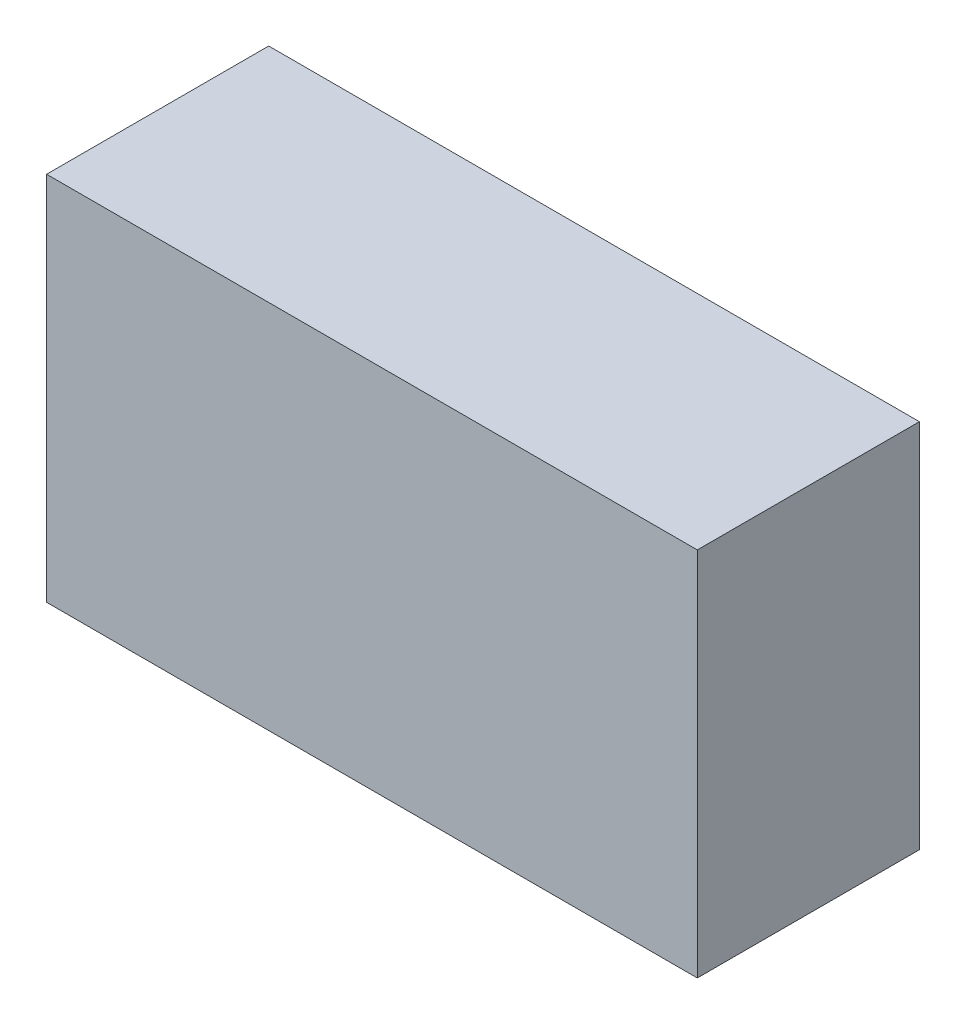
ISO-10303-21;
HEADER;
FILE_DESCRIPTION(('STEP AP214'),'2;1');
FILE_NAME('part.step','',(''),(''),'','','');
FILE_SCHEMA(('AUTOMOTIVE_DESIGN { 1 0 10303 214 1 1 1 1 }'));
ENDSEC;
DATA;
#1=APPLICATION_CONTEXT('core data for automotive mechanical design processes');
#2=APPLICATION_PROTOCOL_DEFINITION('international standard','automotive_design',2000,#1);
#3=PRODUCT_CONTEXT('',#1,'mechanical');
#4=PRODUCT('Part','Part','',(#3));
#5=PRODUCT_RELATED_PRODUCT_CATEGORY('part','',(#4));
#6=PRODUCT_DEFINITION_FORMATION('','',#4);
#7=PRODUCT_DEFINITION_CONTEXT('part definition',#1,'design');
#8=PRODUCT_DEFINITION('design','',#6,#7);
#9=PRODUCT_DEFINITION_SHAPE('','',#8);
#10=(LENGTH_UNIT() NAMED_UNIT(*) SI_UNIT(.MILLI.,.METRE.));
#11=(NAMED_UNIT(*) PLANE_ANGLE_UNIT() SI_UNIT($,.RADIAN.));
#12=(NAMED_UNIT(*) SI_UNIT($,.STERADIAN.) SOLID_ANGLE_UNIT());
#13=UNCERTAINTY_MEASURE_WITH_UNIT(LENGTH_MEASURE(1.E-05),#10,'distance_accuracy_value','');
#14=(GEOMETRIC_REPRESENTATION_CONTEXT(3) GLOBAL_UNCERTAINTY_ASSIGNED_CONTEXT((#13)) GLOBAL_UNIT_ASSIGNED_CONTEXT((#10,
#11,#12)) REPRESENTATION_CONTEXT('',''));
#15=CARTESIAN_POINT('',(0.,0.,0.));
#16=DIRECTION('',(0.,0.,1.));
#17=DIRECTION('',(1.,0.,0.));
#18=AXIS2_PLACEMENT_3D('',#15,#16,#17);
#19=CARTESIAN_POINT('',(-41.4155,77.5714301256037,7.25));
#20=DIRECTION('',(1.,0.,0.));
#21=DIRECTION('',(0.,0.,-1.));
#22=AXIS2_PLACEMENT_3D('',#19,#20,#21);
#23=PLANE('',#22);
#24=DIRECTION('',(0.,-1.,0.));
#25=VECTOR('',#24,1.);
#26=CARTESIAN_POINT('',(-41.4155,77.5714301256037,0.));
#27=LINE('',#26,#25);
#28=CARTESIAN_POINT('',(-41.4155,77.5714301256037,0.));
#29=VERTEX_POINT('',#28);
#30=CARTESIAN_POINT('',(-41.4155,65.47,0.));
#31=VERTEX_POINT('',#30);
#32=EDGE_CURVE('E129',#29,#31,#27,.T.);
#33=ORIENTED_EDGE('',*,*,#32,.T.);
#34=DIRECTION('',(0.,0.,-1.));
#35=VECTOR('',#34,1.);
#36=CARTESIAN_POINT('',(-41.4155,65.47,7.25));
#37=LINE('',#36,#35);
#38=CARTESIAN_POINT('',(-41.4155,65.47,7.25));
#39=VERTEX_POINT('',#38);
#40=EDGE_CURVE('E11',#39,#31,#37,.T.);
#41=ORIENTED_EDGE('',*,*,#40,.F.);
#42=DIRECTION('',(0.,-1.,0.));
#43=VECTOR('',#42,1.);
#44=CARTESIAN_POINT('',(-41.4155,77.5714301256037,7.25));
#45=LINE('',#44,#43);
#46=CARTESIAN_POINT('',(-41.4155,77.5714301256037,7.25));
#47=VERTEX_POINT('',#46);
#48=EDGE_CURVE('E149',#47,#39,#45,.T.);
#49=ORIENTED_EDGE('',*,*,#48,.F.);
#50=DIRECTION('',(0.,0.,-1.));
#51=VECTOR('',#50,1.);
#52=CARTESIAN_POINT('',(-41.4155,77.5714301256037,7.25));
#53=LINE('',#52,#51);
#54=EDGE_CURVE('E154',#47,#29,#53,.T.);
#55=ORIENTED_EDGE('',*,*,#54,.T.);
#56=EDGE_LOOP('',(#33,#41,#49,#55));
#57=FACE_BOUND('',#56,.T.);
#58=ADVANCED_FACE('F33',(#57),#23,.F.);
#59=CARTESIAN_POINT('',(-41.4155,65.47,7.25));
#60=DIRECTION('',(0.,1.,0.));
#61=DIRECTION('',(0.,0.,1.));
#62=AXIS2_PLACEMENT_3D('',#59,#60,#61);
#63=PLANE('',#62);
#64=DIRECTION('',(1.,0.,0.));
#65=VECTOR('',#64,1.);
#66=CARTESIAN_POINT('',(-41.4155,65.47,0.));
#67=LINE('',#66,#65);
#68=CARTESIAN_POINT('',(-20.1755,65.47,0.));
#69=VERTEX_POINT('',#68);
#70=EDGE_CURVE('E133',#31,#69,#67,.T.);
#71=ORIENTED_EDGE('',*,*,#70,.T.);
#72=DIRECTION('',(0.,0.,-1.));
#73=VECTOR('',#72,1.);
#74=CARTESIAN_POINT('',(-20.1755,65.47,7.25));
#75=LINE('',#74,#73);
#76=CARTESIAN_POINT('',(-20.1755,65.47,7.25));
#77=VERTEX_POINT('',#76);
#78=EDGE_CURVE('E40',#77,#69,#75,.T.);
#79=ORIENTED_EDGE('',*,*,#78,.F.);
#80=DIRECTION('',(1.,0.,0.));
#81=VECTOR('',#80,1.);
#82=CARTESIAN_POINT('',(-41.4155,65.47,7.25));
#83=LINE('',#82,#81);
#84=EDGE_CURVE('E84',#39,#77,#83,.T.);
#85=ORIENTED_EDGE('',*,*,#84,.F.);
#86=ORIENTED_EDGE('',*,*,#40,.T.);
#87=EDGE_LOOP('',(#71,#79,#85,#86));
#88=FACE_BOUND('',#87,.T.);
#89=ADVANCED_FACE('F183',(#88),#63,.F.);
#90=CARTESIAN_POINT('',(-20.1755,77.5714301256037,7.25));
#91=DIRECTION('',(-1.,0.,0.));
#92=DIRECTION('',(0.,0.,1.));
#93=AXIS2_PLACEMENT_3D('',#90,#91,#92);
#94=PLANE('',#93);
#95=DIRECTION('',(0.,1.,0.));
#96=VECTOR('',#95,1.);
#97=CARTESIAN_POINT('',(-20.1755,77.5714301256037,0.));
#98=LINE('',#97,#96);
#99=CARTESIAN_POINT('',(-20.1755,77.5714301256037,0.));
#100=VERTEX_POINT('',#99);
#101=EDGE_CURVE('E157',#69,#100,#98,.T.);
#102=ORIENTED_EDGE('',*,*,#101,.T.);
#103=DIRECTION('',(0.,0.,-1.));
#104=VECTOR('',#103,1.);
#105=CARTESIAN_POINT('',(-20.1755,77.5714301256037,7.25));
#106=LINE('',#105,#104);
#107=CARTESIAN_POINT('',(-20.1755,77.5714301256037,7.25));
#108=VERTEX_POINT('',#107);
#109=EDGE_CURVE('E161',#108,#100,#106,.T.);
#110=ORIENTED_EDGE('',*,*,#109,.F.);
#111=DIRECTION('',(0.,1.,0.));
#112=VECTOR('',#111,1.);
#113=CARTESIAN_POINT('',(-20.1755,77.5714301256037,7.25));
#114=LINE('',#113,#112);
#115=EDGE_CURVE('E152',#77,#108,#114,.T.);
#116=ORIENTED_EDGE('',*,*,#115,.F.);
#117=ORIENTED_EDGE('',*,*,#78,.T.);
#118=EDGE_LOOP('',(#102,#110,#116,#117));
#119=FACE_BOUND('',#118,.T.);
#120=ADVANCED_FACE('F166',(#119),#94,.F.);
#121=CARTESIAN_POINT('',(-41.4155,77.5714301256037,7.25));
#122=DIRECTION('',(0.,-1.,0.));
#123=DIRECTION('',(0.,0.,-1.));
#124=AXIS2_PLACEMENT_3D('',#121,#122,#123);
#125=PLANE('',#124);
#126=DIRECTION('',(-1.,0.,0.));
#127=VECTOR('',#126,1.);
#128=CARTESIAN_POINT('',(-41.4155,77.5714301256037,0.));
#129=LINE('',#128,#127);
#130=EDGE_CURVE('E77',#100,#29,#129,.T.);
#131=ORIENTED_EDGE('',*,*,#130,.T.);
#132=ORIENTED_EDGE('',*,*,#54,.F.);
#133=DIRECTION('',(-1.,0.,0.));
#134=VECTOR('',#133,1.);
#135=CARTESIAN_POINT('',(-41.4155,77.5714301256037,7.25));
#136=LINE('',#135,#134);
#137=EDGE_CURVE('E56',#108,#47,#136,.T.);
#138=ORIENTED_EDGE('',*,*,#137,.F.);
#139=ORIENTED_EDGE('',*,*,#109,.T.);
#140=EDGE_LOOP('',(#131,#132,#138,#139));
#141=FACE_BOUND('',#140,.T.);
#142=ADVANCED_FACE('F174',(#141),#125,.F.);
#143=CARTESIAN_POINT('',(0.,0.,7.25));
#144=DIRECTION('',(0.,0.,1.));
#145=DIRECTION('',(1.,0.,0.));
#146=AXIS2_PLACEMENT_3D('',#143,#144,#145);
#147=PLANE('',#146);
#148=ORIENTED_EDGE('',*,*,#48,.T.);
#149=ORIENTED_EDGE('',*,*,#84,.T.);
#150=ORIENTED_EDGE('',*,*,#115,.T.);
#151=ORIENTED_EDGE('',*,*,#137,.T.);
#152=EDGE_LOOP('',(#148,#149,#150,#151));
#153=FACE_BOUND('',#152,.T.);
#154=ADVANCED_FACE('F176',(#153),#147,.T.);
#155=CARTESIAN_POINT('',(0.,0.,0.));
#156=DIRECTION('',(0.,0.,1.));
#157=DIRECTION('',(1.,0.,0.));
#158=AXIS2_PLACEMENT_3D('',#155,#156,#157);
#159=PLANE('',#158);
#160=DIRECTION('',(-1.,0.,0.));
#161=VECTOR('',#160,1.);
#162=CARTESIAN_POINT('',(-41.4155,77.0714301256037,0.));
#163=LINE('',#162,#161);
#164=CARTESIAN_POINT('',(-20.6755,77.0714301256037,0.));
#165=VERTEX_POINT('',#164);
#166=CARTESIAN_POINT('',(-40.9155,77.0714301256037,0.));
#167=VERTEX_POINT('',#166);
#168=EDGE_CURVE('E124',#165,#167,#163,.T.);
#169=ORIENTED_EDGE('',*,*,#168,.T.);
#170=DIRECTION('',(0.,-1.,0.));
#171=VECTOR('',#170,1.);
#172=CARTESIAN_POINT('',(-40.9155,77.5714301256037,0.));
#173=LINE('',#172,#171);
#174=CARTESIAN_POINT('',(-40.9155,65.97,0.));
#175=VERTEX_POINT('',#174);
#176=EDGE_CURVE('E143',#167,#175,#173,.T.);
#177=ORIENTED_EDGE('',*,*,#176,.T.);
#178=DIRECTION('',(1.,0.,0.));
#179=VECTOR('',#178,1.);
#180=CARTESIAN_POINT('',(-41.4155,65.97,0.));
#181=LINE('',#180,#179);
#182=CARTESIAN_POINT('',(-20.6755,65.97,0.));
#183=VERTEX_POINT('',#182);
#184=EDGE_CURVE('E128',#175,#183,#181,.T.);
#185=ORIENTED_EDGE('',*,*,#184,.T.);
#186=DIRECTION('',(0.,1.,0.));
#187=VECTOR('',#186,1.);
#188=CARTESIAN_POINT('',(-20.6755,77.5714301256037,0.));
#189=LINE('',#188,#187);
#190=EDGE_CURVE('E47',#183,#165,#189,.T.);
#191=ORIENTED_EDGE('',*,*,#190,.T.);
#192=EDGE_LOOP('',(#169,#177,#185,#191));
#193=FACE_BOUND('',#192,.T.);
#194=ORIENTED_EDGE('',*,*,#32,.F.);
#195=ORIENTED_EDGE('',*,*,#130,.F.);
#196=ORIENTED_EDGE('',*,*,#101,.F.);
#197=ORIENTED_EDGE('',*,*,#70,.F.);
#198=EDGE_LOOP('',(#194,#195,#196,#197));
#199=FACE_BOUND('',#198,.T.);
#200=ADVANCED_FACE('F170',(#193,#199),#159,.F.);
#201=CARTESIAN_POINT('',(-40.9155,77.5714301256037,7.25));
#202=DIRECTION('',(1.,0.,0.));
#203=DIRECTION('',(0.,0.,-1.));
#204=AXIS2_PLACEMENT_3D('',#201,#202,#203);
#205=PLANE('',#204);
#206=ORIENTED_EDGE('',*,*,#176,.F.);
#207=DIRECTION('',(0.,0.,-1.));
#208=VECTOR('',#207,1.);
#209=CARTESIAN_POINT('',(-40.9155,77.0714301256037,7.25));
#210=LINE('',#209,#208);
#211=CARTESIAN_POINT('',(-40.9155,77.0714301256037,7.05));
#212=VERTEX_POINT('',#211);
#213=EDGE_CURVE('E123',#212,#167,#210,.T.);
#214=ORIENTED_EDGE('',*,*,#213,.F.);
#215=DIRECTION('',(0.,-1.,0.));
#216=VECTOR('',#215,1.);
#217=CARTESIAN_POINT('',(-40.9155,77.5714301256037,7.05));
#218=LINE('',#217,#216);
#219=CARTESIAN_POINT('',(-40.9155,65.97,7.05));
#220=VERTEX_POINT('',#219);
#221=EDGE_CURVE('E111',#212,#220,#218,.T.);
#222=ORIENTED_EDGE('',*,*,#221,.T.);
#223=DIRECTION('',(0.,0.,-1.));
#224=VECTOR('',#223,1.);
#225=CARTESIAN_POINT('',(-40.9155,65.97,7.25));
#226=LINE('',#225,#224);
#227=EDGE_CURVE('E121',#220,#175,#226,.T.);
#228=ORIENTED_EDGE('',*,*,#227,.T.);
#229=EDGE_LOOP('',(#206,#214,#222,#228));
#230=FACE_BOUND('',#229,.T.);
#231=ADVANCED_FACE('F120',(#230),#205,.T.);
#232=CARTESIAN_POINT('',(-41.4155,65.97,7.25));
#233=DIRECTION('',(0.,1.,0.));
#234=DIRECTION('',(0.,0.,1.));
#235=AXIS2_PLACEMENT_3D('',#232,#233,#234);
#236=PLANE('',#235);
#237=ORIENTED_EDGE('',*,*,#184,.F.);
#238=ORIENTED_EDGE('',*,*,#227,.F.);
#239=DIRECTION('',(1.,0.,0.));
#240=VECTOR('',#239,1.);
#241=CARTESIAN_POINT('',(-41.4155,65.97,7.05));
#242=LINE('',#241,#240);
#243=CARTESIAN_POINT('',(-20.6755,65.97,7.05));
#244=VERTEX_POINT('',#243);
#245=EDGE_CURVE('E107',#220,#244,#242,.T.);
#246=ORIENTED_EDGE('',*,*,#245,.T.);
#247=DIRECTION('',(0.,0.,-1.));
#248=VECTOR('',#247,1.);
#249=CARTESIAN_POINT('',(-20.6755,65.97,7.25));
#250=LINE('',#249,#248);
#251=EDGE_CURVE('E130',#244,#183,#250,.T.);
#252=ORIENTED_EDGE('',*,*,#251,.T.);
#253=EDGE_LOOP('',(#237,#238,#246,#252));
#254=FACE_BOUND('',#253,.T.);
#255=ADVANCED_FACE('F126',(#254),#236,.T.);
#256=CARTESIAN_POINT('',(-20.6755,77.5714301256037,7.25));
#257=DIRECTION('',(-1.,0.,0.));
#258=DIRECTION('',(0.,0.,1.));
#259=AXIS2_PLACEMENT_3D('',#256,#257,#258);
#260=PLANE('',#259);
#261=ORIENTED_EDGE('',*,*,#190,.F.);
#262=ORIENTED_EDGE('',*,*,#251,.F.);
#263=DIRECTION('',(0.,1.,0.));
#264=VECTOR('',#263,1.);
#265=CARTESIAN_POINT('',(-20.6755,77.5714301256037,7.05));
#266=LINE('',#265,#264);
#267=CARTESIAN_POINT('',(-20.6755,77.0714301256037,7.05));
#268=VERTEX_POINT('',#267);
#269=EDGE_CURVE('E112',#244,#268,#266,.T.);
#270=ORIENTED_EDGE('',*,*,#269,.T.);
#271=DIRECTION('',(0.,0.,-1.));
#272=VECTOR('',#271,1.);
#273=CARTESIAN_POINT('',(-20.6755,77.0714301256037,7.25));
#274=LINE('',#273,#272);
#275=EDGE_CURVE('E135',#268,#165,#274,.T.);
#276=ORIENTED_EDGE('',*,*,#275,.T.);
#277=EDGE_LOOP('',(#261,#262,#270,#276));
#278=FACE_BOUND('',#277,.T.);
#279=ADVANCED_FACE('F231',(#278),#260,.T.);
#280=CARTESIAN_POINT('',(-41.4155,77.0714301256037,7.25));
#281=DIRECTION('',(0.,-1.,0.));
#282=DIRECTION('',(0.,0.,-1.));
#283=AXIS2_PLACEMENT_3D('',#280,#281,#282);
#284=PLANE('',#283);
#285=ORIENTED_EDGE('',*,*,#168,.F.);
#286=ORIENTED_EDGE('',*,*,#275,.F.);
#287=DIRECTION('',(-1.,0.,0.));
#288=VECTOR('',#287,1.);
#289=CARTESIAN_POINT('',(-41.4155,77.0714301256037,7.05));
#290=LINE('',#289,#288);
#291=EDGE_CURVE('E138',#268,#212,#290,.T.);
#292=ORIENTED_EDGE('',*,*,#291,.T.);
#293=ORIENTED_EDGE('',*,*,#213,.T.);
#294=EDGE_LOOP('',(#285,#286,#292,#293));
#295=FACE_BOUND('',#294,.T.);
#296=ADVANCED_FACE('F240',(#295),#284,.T.);
#297=CARTESIAN_POINT('',(0.,0.,7.05));
#298=DIRECTION('',(0.,0.,1.));
#299=DIRECTION('',(1.,0.,0.));
#300=AXIS2_PLACEMENT_3D('',#297,#298,#299);
#301=PLANE('',#300);
#302=ORIENTED_EDGE('',*,*,#221,.F.);
#303=ORIENTED_EDGE('',*,*,#291,.F.);
#304=ORIENTED_EDGE('',*,*,#269,.F.);
#305=ORIENTED_EDGE('',*,*,#245,.F.);
#306=EDGE_LOOP('',(#302,#303,#304,#305));
#307=FACE_BOUND('',#306,.T.);
#308=ADVANCED_FACE('F109',(#307),#301,.F.);
#309=CLOSED_SHELL('',(#58,#89,#120,#142,#154,#200,#231,#255,#279,#296,#308));
#310=MANIFOLD_SOLID_BREP('B2',#309);
#311=ADVANCED_BREP_SHAPE_REPRESENTATION('',(#18,#310),#14);
#312=SHAPE_DEFINITION_REPRESENTATION(#9,#311);
ENDSEC;
END-ISO-10303-21;
